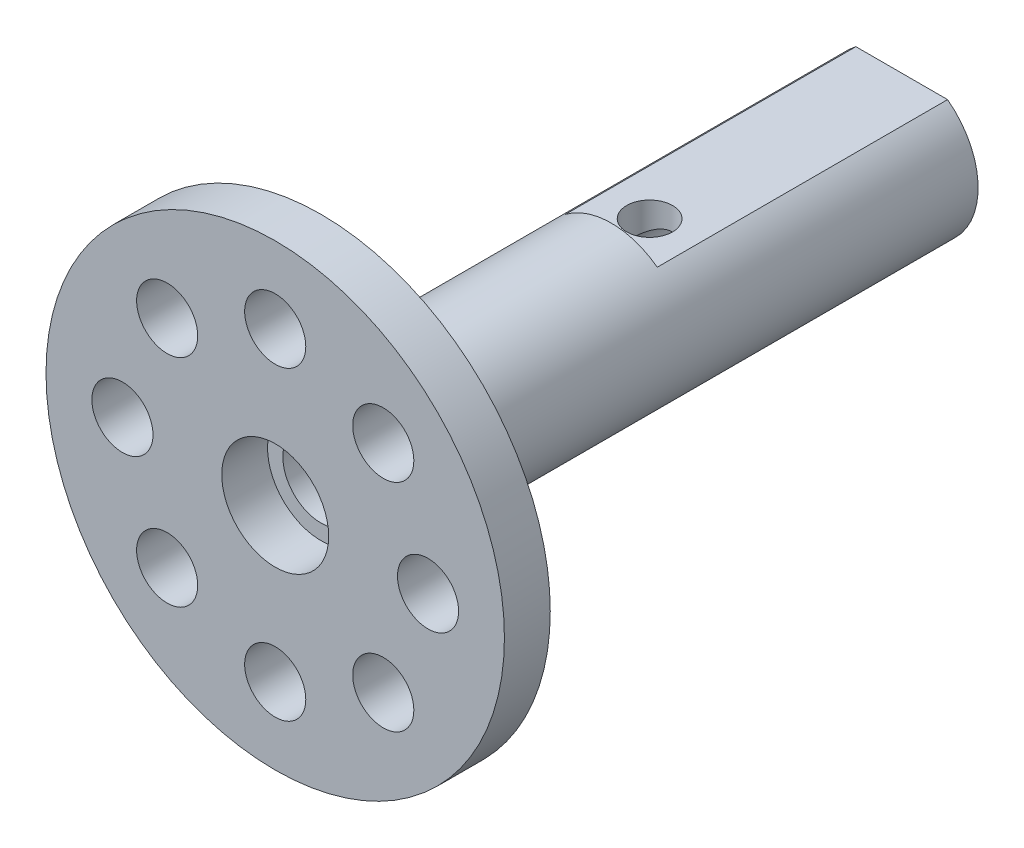
ISO-10303-21;
HEADER;
FILE_DESCRIPTION(('STEP AP214'),'2;1');
FILE_NAME('part.step','',(''),(''),'','','');
FILE_SCHEMA(('AUTOMOTIVE_DESIGN { 1 0 10303 214 1 1 1 1 }'));
ENDSEC;
DATA;
#1=APPLICATION_CONTEXT('core data for automotive mechanical design processes');
#2=APPLICATION_PROTOCOL_DEFINITION('international standard','automotive_design',2000,#1);
#3=PRODUCT_CONTEXT('',#1,'mechanical');
#4=PRODUCT('Part','Part','',(#3));
#5=PRODUCT_RELATED_PRODUCT_CATEGORY('part','',(#4));
#6=PRODUCT_DEFINITION_FORMATION('','',#4);
#7=PRODUCT_DEFINITION_CONTEXT('part definition',#1,'design');
#8=PRODUCT_DEFINITION('design','',#6,#7);
#9=PRODUCT_DEFINITION_SHAPE('','',#8);
#10=(LENGTH_UNIT() NAMED_UNIT(*) SI_UNIT(.MILLI.,.METRE.));
#11=(NAMED_UNIT(*) PLANE_ANGLE_UNIT() SI_UNIT($,.RADIAN.));
#12=(NAMED_UNIT(*) SI_UNIT($,.STERADIAN.) SOLID_ANGLE_UNIT());
#13=UNCERTAINTY_MEASURE_WITH_UNIT(LENGTH_MEASURE(1.E-05),#10,'distance_accuracy_value','');
#14=(GEOMETRIC_REPRESENTATION_CONTEXT(3) GLOBAL_UNCERTAINTY_ASSIGNED_CONTEXT((#13)) GLOBAL_UNIT_ASSIGNED_CONTEXT((#10,
#11,#12)) REPRESENTATION_CONTEXT('',''));
#15=CARTESIAN_POINT('',(0.,0.,0.));
#16=DIRECTION('',(0.,0.,1.));
#17=DIRECTION('',(1.,0.,0.));
#18=AXIS2_PLACEMENT_3D('',#15,#16,#17);
#19=CARTESIAN_POINT('',(0.,0.,41.));
#20=DIRECTION('',(0.,0.,-1.));
#21=DIRECTION('',(-1.,0.,0.));
#22=AXIS2_PLACEMENT_3D('',#19,#20,#21);
#23=CYLINDRICAL_SURFACE('',#22,2.5);
#24=CARTESIAN_POINT('',(0.,-2.5,18.));
#25=CARTESIAN_POINT('',(0.0767298334620158,-2.49999625789732,17.9999959089901));
#26=CARTESIAN_POINT('',(0.153582320644178,-2.4964290461501,17.9940713290737));
#27=CARTESIAN_POINT('',(0.304975509530679,-2.48249903608568,17.9706756804847));
#28=CARTESIAN_POINT('',(0.379510034596047,-2.47211948032719,17.9531761381458));
#29=CARTESIAN_POINT('',(0.523751827790836,-2.44561558054488,17.9076136388331));
#30=CARTESIAN_POINT('',(0.593481028226565,-2.42951973272944,17.8796030418368));
#31=CARTESIAN_POINT('',(0.727030318214658,-2.39295367626407,17.814139666859));
#32=CARTESIAN_POINT('',(0.790851869416382,-2.37248455380255,17.7766892330313));
#33=CARTESIAN_POINT('',(0.916299278999314,-2.32705360719088,17.6902251732914));
#34=CARTESIAN_POINT('',(0.977384020081414,-2.30186792195985,17.6405463046486));
#35=CARTESIAN_POINT('',(1.09088270411891,-2.25030439279634,17.5325327961717));
#36=CARTESIAN_POINT('',(1.14328534948112,-2.22392505153571,17.4741870628127));
#37=CARTESIAN_POINT('',(1.24444996762974,-2.1691106699591,17.3420764895033));
#38=CARTESIAN_POINT('',(1.29197766378809,-2.14082017703649,17.2672982290187));
#39=CARTESIAN_POINT('',(1.37361437764896,-2.08938301412124,17.1091534267569));
#40=CARTESIAN_POINT('',(1.4077451733516,-2.06622802273938,17.0258011037524));
#41=CARTESIAN_POINT('',(1.45440601714221,-2.0335462966093,16.8734035493468));
#42=CARTESIAN_POINT('',(1.47016197246826,-2.02207883137591,16.8057640013897));
#43=CARTESIAN_POINT('',(1.49216172340475,-2.00590308295503,16.6681962841696));
#44=CARTESIAN_POINT('',(1.49841734556836,-2.00118639643759,16.5982710712455));
#45=CARTESIAN_POINT('',(1.50105508796009,-1.99920922463856,16.4579885057827));
#46=CARTESIAN_POINT('',(1.49741783408419,-2.00196337012718,16.3876305749068));
#47=CARTESIAN_POINT('',(1.48046060478828,-2.01453261443741,16.2487212245724));
#48=CARTESIAN_POINT('',(1.46713334620103,-2.02435302432226,16.1801712041526));
#49=CARTESIAN_POINT('',(1.43173921881792,-2.04953186944258,16.0474697578719));
#50=CARTESIAN_POINT('',(1.40978748666087,-2.06481711652537,15.9832729460755));
#51=CARTESIAN_POINT('',(1.35795061770837,-2.09927051350828,15.8593050090719));
#52=CARTESIAN_POINT('',(1.32806257259705,-2.11844008623465,15.7995355165761));
#53=CARTESIAN_POINT('',(1.25517983184583,-2.16255327268985,15.6750159028772));
#54=CARTESIAN_POINT('',(1.21080724397723,-2.18792043372992,15.6112219070451));
#55=CARTESIAN_POINT('',(1.11291092784003,-2.23930599764381,15.491323516333));
#56=CARTESIAN_POINT('',(1.05937845100579,-2.26532500262149,15.4352265660235));
#57=CARTESIAN_POINT('',(0.935811834382971,-2.31935504958316,15.3243870181782));
#58=CARTESIAN_POINT('',(0.864517682704961,-2.34713836268532,15.270922693984));
#59=CARTESIAN_POINT('',(0.712276050459004,-2.3977242843398,15.1768779528021));
#60=CARTESIAN_POINT('',(0.631333763943569,-2.42052955425515,15.13629064621));
#61=CARTESIAN_POINT('',(0.467197585268211,-2.45730392066151,15.0720678172041));
#62=CARTESIAN_POINT('',(0.384467624173585,-2.47173957439704,15.0475246442841));
#63=CARTESIAN_POINT('',(0.215047895144645,-2.4921884281355,15.0129888025946));
#64=CARTESIAN_POINT('',(0.128363005661325,-2.49821172952738,15.0029786822464));
#65=CARTESIAN_POINT('',(-0.0337146143773909,-2.5009057037461,14.9984921523217));
#66=CARTESIAN_POINT('',(-0.109042473418712,-2.49873521714286,15.0020911449148));
#67=CARTESIAN_POINT('',(-0.257829401986055,-2.48778712087049,15.0204258530719));
#68=CARTESIAN_POINT('',(-0.331288509376101,-2.47900964518037,15.0351613428058));
#69=CARTESIAN_POINT('',(-0.472574932157608,-2.45594792442191,15.0745434328125));
#70=CARTESIAN_POINT('',(-0.540495750928479,-2.44180275662555,15.0989403490735));
#71=CARTESIAN_POINT('',(-0.671265749087259,-2.40913880862845,15.1566773763653));
#72=CARTESIAN_POINT('',(-0.734113924963904,-2.39061916586511,15.1900192513467));
#73=CARTESIAN_POINT('',(-0.86000626282386,-2.34845496237361,15.2685569792087));
#74=CARTESIAN_POINT('',(-0.922394150456834,-2.3244780273988,15.3146238290784));
#75=CARTESIAN_POINT('',(-1.03902603131013,-2.27474265574732,15.4153913934886));
#76=CARTESIAN_POINT('',(-1.09326040273738,-2.24898216586361,15.4701021548525));
#77=CARTESIAN_POINT('',(-1.19931996735579,-2.19445423909891,15.5949103900371));
#78=CARTESIAN_POINT('',(-1.24991019630914,-2.16573241746291,15.6660838854655));
#79=CARTESIAN_POINT('',(-1.33845238915667,-2.1121618206671,15.8172160245682));
#80=CARTESIAN_POINT('',(-1.37641766769781,-2.0873089799769,15.8971652938928));
#81=CARTESIAN_POINT('',(-1.43142578795776,-2.04984909240519,16.0462430223067));
#82=CARTESIAN_POINT('',(-1.4512162533619,-2.03575659328729,16.1139803123586));
#83=CARTESIAN_POINT('',(-1.48113663905972,-2.01409605743544,16.2525320780801));
#84=CARTESIAN_POINT('',(-1.49127995297631,-2.00651897642721,16.3233421443278));
#85=CARTESIAN_POINT('',(-1.50134130416631,-1.99900446616268,16.466376947597));
#86=CARTESIAN_POINT('',(-1.50122089107869,-1.99909576445937,16.538605990687));
#87=CARTESIAN_POINT('',(-1.49066472959328,-2.0069771789285,16.6818944356095));
#88=CARTESIAN_POINT('',(-1.48022337215759,-2.0147714813882,16.7529531800806));
#89=CARTESIAN_POINT('',(-1.45040174148913,-2.0363318524298,16.8884884175722));
#90=CARTESIAN_POINT('',(-1.43147636845351,-2.0497921180558,16.9531170943069));
#91=CARTESIAN_POINT('',(-1.38563242076993,-2.08105501960151,17.0783372544742));
#92=CARTESIAN_POINT('',(-1.3587108358848,-2.09885929040482,17.1389272069606));
#93=CARTESIAN_POINT('',(-1.29289245555732,-2.14012990550917,17.2643198572208));
#94=CARTESIAN_POINT('',(-1.25279167675753,-2.16404587582639,17.3283411038543));
#95=CARTESIAN_POINT('',(-1.16375698389084,-2.21320127030768,17.4493800726173));
#96=CARTESIAN_POINT('',(-1.11481579607798,-2.23844177205021,17.5063919621526));
#97=CARTESIAN_POINT('',(-1.00009777425734,-2.29225690291476,17.6213509491317));
#98=CARTESIAN_POINT('',(-0.932876819313905,-2.32070308663658,17.6779310748962));
#99=CARTESIAN_POINT('',(-0.78846243444559,-2.37365428872367,17.7790978558633));
#100=CARTESIAN_POINT('',(-0.71126544450154,-2.39815789310936,17.8236802119848));
#101=CARTESIAN_POINT('',(-0.551125230801453,-2.43985578654394,17.8977858075737));
#102=CARTESIAN_POINT('',(-0.468430086957213,-2.45725077479787,17.9277280649268));
#103=CARTESIAN_POINT('',(-0.297973306118807,-2.48366273001246,17.972724695211));
#104=CARTESIAN_POINT('',(-0.210232099648612,-2.49271125871485,17.987835167857));
#105=CARTESIAN_POINT('',(-0.101558096917536,-2.49802001168187,17.9966974547087));
#106=CARTESIAN_POINT('',(-0.0812762590282773,-2.49876114656362,17.9979344173061));
#107=CARTESIAN_POINT('',(-0.0406658206871123,-2.49975164517367,17.9995862463709));
#108=CARTESIAN_POINT('',(-0.0203372186375694,-2.50000099184316,18.0000010843209));
#109=CARTESIAN_POINT('',(0.,-2.5,18.));
#110=B_SPLINE_CURVE_WITH_KNOTS('',3,(#24,#25,#26,#27,#28,#29,#30,#31,#32,#33,#34,#35,#36,#37,
#38,#39,#40,#41,#42,#43,#44,#45,#46,#47,#48,#49,#50,#51,#52,#53,#54,#55,#56,#57,#58,#59,#60,#61,
#62,#63,#64,#65,#66,#67,#68,#69,#70,#71,#72,#73,#74,#75,#76,#77,#78,#79,#80,#81,#82,#83,#84,#85,
#86,#87,#88,#89,#90,#91,#92,#93,#94,#95,#96,#97,#98,#99,#100,#101,#102,#103,#104,#105,#106,#107,
#108,#109),.UNSPECIFIED.,.T.,.F.,(4,2,2,2,2,2,2,2,2,2,2,2,2,2,2,2,2,2,2,2,2,2,2,2,2,2,2,2,2,2,2,
2,2,2,2,2,2,2,2,2,2,2,4),(0.,0.230102237548649,0.460772627520011,0.69030888460001,
0.919788197992274,1.16681590732472,1.414162579348,1.69183813189807,1.96906040692091,
2.17933829855633,2.38935420916578,2.59978170870726,2.81036753273872,3.01823267593207,
3.22617409809868,3.47046995225162,3.71500044803674,3.99360957884691,4.27206939275324,
4.53296790696559,4.79355286918235,5.01875602722426,5.24395461863455,5.46367785689771,
5.68344445659025,5.92601365818362,6.16886690081836,6.44336762428009,6.71757792616456,
6.93257787314692,7.14727888733319,7.36278425777433,7.57840681155725,7.78364098331142,
7.98895251523035,8.22578610052286,8.46281544370208,8.73854311775519,9.01436946031985,
9.28175654462677,9.54812832184448,9.60911473335177,9.67010326027641),.UNSPECIFIED.);
#111=CARTESIAN_POINT('',(0.,-2.5,18.));
#112=VERTEX_POINT('',#111);
#113=EDGE_CURVE('E184',#112,#112,#110,.T.);
#114=ORIENTED_EDGE('',*,*,#113,.F.);
#115=EDGE_LOOP('',(#114));
#116=FACE_BOUND('',#115,.T.);
#117=CARTESIAN_POINT('',(0.,0.,0.));
#118=DIRECTION('',(0.,0.,-1.));
#119=DIRECTION('',(-1.,0.,0.));
#120=AXIS2_PLACEMENT_3D('',#117,#118,#119);
#121=CIRCLE('',#120,2.5);
#122=CARTESIAN_POINT('',(-2.5,0.,0.));
#123=VERTEX_POINT('',#122);
#124=EDGE_CURVE('E185',#123,#123,#121,.T.);
#125=ORIENTED_EDGE('',*,*,#124,.T.);
#126=EDGE_LOOP('',(#125));
#127=FACE_BOUND('',#126,.T.);
#128=CARTESIAN_POINT('',(0.,2.5,18.));
#129=CARTESIAN_POINT('',(-0.0767298334620155,2.49999625789733,17.9999959089901));
#130=CARTESIAN_POINT('',(-0.153582320644177,2.4964290461501,17.9940713290737));
#131=CARTESIAN_POINT('',(-0.304975509530678,2.48249903608567,17.9706756804847));
#132=CARTESIAN_POINT('',(-0.379510034596046,2.47211948032719,17.9531761381458));
#133=CARTESIAN_POINT('',(-0.523751827790837,2.44561558054488,17.9076136388331));
#134=CARTESIAN_POINT('',(-0.593481028226567,2.42951973272944,17.8796030418368));
#135=CARTESIAN_POINT('',(-0.727030318214659,2.39295367626407,17.814139666859));
#136=CARTESIAN_POINT('',(-0.790851869416383,2.37248455380255,17.7766892330313));
#137=CARTESIAN_POINT('',(-0.916299278999314,2.32705360719088,17.6902251732914));
#138=CARTESIAN_POINT('',(-0.977384020081414,2.30186792195985,17.6405463046486));
#139=CARTESIAN_POINT('',(-1.09088270411891,2.25030439279634,17.5325327961717));
#140=CARTESIAN_POINT('',(-1.14328534948112,2.22392505153571,17.4741870628127));
#141=CARTESIAN_POINT('',(-1.24444996762974,2.1691106699591,17.3420764895033));
#142=CARTESIAN_POINT('',(-1.29197766378809,2.14082017703649,17.2672982290187));
#143=CARTESIAN_POINT('',(-1.37361437764896,2.08938301412124,17.1091534267569));
#144=CARTESIAN_POINT('',(-1.4077451733516,2.06622802273938,17.0258011037524));
#145=CARTESIAN_POINT('',(-1.45440601714221,2.0335462966093,16.8734035493468));
#146=CARTESIAN_POINT('',(-1.47016197246826,2.02207883137591,16.8057640013897));
#147=CARTESIAN_POINT('',(-1.49216172340475,2.00590308295503,16.6681962841696));
#148=CARTESIAN_POINT('',(-1.49841734556836,2.00118639643759,16.5982710712455));
#149=CARTESIAN_POINT('',(-1.50105508796009,1.99920922463856,16.4579885057827));
#150=CARTESIAN_POINT('',(-1.49741783408419,2.00196337012718,16.3876305749068));
#151=CARTESIAN_POINT('',(-1.48046060478828,2.01453261443741,16.2487212245724));
#152=CARTESIAN_POINT('',(-1.46713334620103,2.02435302432226,16.1801712041526));
#153=CARTESIAN_POINT('',(-1.43173921881793,2.04953186944258,16.0474697578719));
#154=CARTESIAN_POINT('',(-1.40978748666087,2.06481711652537,15.9832729460755));
#155=CARTESIAN_POINT('',(-1.35795061770837,2.09927051350828,15.8593050090719));
#156=CARTESIAN_POINT('',(-1.32806257259705,2.11844008623465,15.7995355165761));
#157=CARTESIAN_POINT('',(-1.25517983184583,2.16255327268985,15.6750159028772));
#158=CARTESIAN_POINT('',(-1.21080724397723,2.18792043372992,15.6112219070451));
#159=CARTESIAN_POINT('',(-1.11291092784003,2.23930599764381,15.491323516333));
#160=CARTESIAN_POINT('',(-1.05937845100579,2.26532500262149,15.4352265660235));
#161=CARTESIAN_POINT('',(-0.935811834382971,2.31935504958316,15.3243870181782));
#162=CARTESIAN_POINT('',(-0.864517682704962,2.34713836268532,15.270922693984));
#163=CARTESIAN_POINT('',(-0.712276050459006,2.3977242843398,15.1768779528021));
#164=CARTESIAN_POINT('',(-0.63133376394357,2.42052955425515,15.1362906462101));
#165=CARTESIAN_POINT('',(-0.467197585268212,2.45730392066151,15.0720678172041));
#166=CARTESIAN_POINT('',(-0.384467624173586,2.47173957439703,15.0475246442841));
#167=CARTESIAN_POINT('',(-0.215047895144646,2.4921884281355,15.0129888025946));
#168=CARTESIAN_POINT('',(-0.128363005661326,2.49821172952738,15.0029786822464));
#169=CARTESIAN_POINT('',(0.0337146143773895,2.5009057037461,14.9984921523217));
#170=CARTESIAN_POINT('',(0.109042473418711,2.49873521714286,15.0020911449148));
#171=CARTESIAN_POINT('',(0.257829401986054,2.48778712087049,15.0204258530719));
#172=CARTESIAN_POINT('',(0.3312885093761,2.47900964518037,15.0351613428058));
#173=CARTESIAN_POINT('',(0.472574932157608,2.45594792442191,15.0745434328125));
#174=CARTESIAN_POINT('',(0.540495750928479,2.44180275662555,15.0989403490735));
#175=CARTESIAN_POINT('',(0.671265749087258,2.40913880862845,15.1566773763653));
#176=CARTESIAN_POINT('',(0.734113924963904,2.39061916586511,15.1900192513467));
#177=CARTESIAN_POINT('',(0.86000626282386,2.34845496237361,15.2685569792087));
#178=CARTESIAN_POINT('',(0.922394150456833,2.3244780273988,15.3146238290784));
#179=CARTESIAN_POINT('',(1.03902603131013,2.27474265574732,15.4153913934886));
#180=CARTESIAN_POINT('',(1.09326040273738,2.24898216586361,15.4701021548525));
#181=CARTESIAN_POINT('',(1.19931996735579,2.19445423909891,15.5949103900371));
#182=CARTESIAN_POINT('',(1.24991019630914,2.16573241746291,15.6660838854655));
#183=CARTESIAN_POINT('',(1.33845238915667,2.1121618206671,15.8172160245682));
#184=CARTESIAN_POINT('',(1.37641766769781,2.0873089799769,15.8971652938928));
#185=CARTESIAN_POINT('',(1.43142578795776,2.04984909240519,16.0462430223067));
#186=CARTESIAN_POINT('',(1.4512162533619,2.03575659328729,16.1139803123586));
#187=CARTESIAN_POINT('',(1.48113663905972,2.01409605743544,16.2525320780801));
#188=CARTESIAN_POINT('',(1.49127995297631,2.00651897642721,16.3233421443278));
#189=CARTESIAN_POINT('',(1.50134130416631,1.99900446616268,16.466376947597));
#190=CARTESIAN_POINT('',(1.50122089107869,1.99909576445937,16.538605990687));
#191=CARTESIAN_POINT('',(1.49066472959328,2.0069771789285,16.6818944356095));
#192=CARTESIAN_POINT('',(1.48022337215759,2.0147714813882,16.7529531800806));
#193=CARTESIAN_POINT('',(1.45040174148913,2.0363318524298,16.8884884175722));
#194=CARTESIAN_POINT('',(1.43147636845351,2.0497921180558,16.9531170943069));
#195=CARTESIAN_POINT('',(1.38563242076993,2.08105501960151,17.0783372544742));
#196=CARTESIAN_POINT('',(1.3587108358848,2.09885929040482,17.1389272069606));
#197=CARTESIAN_POINT('',(1.29289245555732,2.14012990550917,17.2643198572208));
#198=CARTESIAN_POINT('',(1.25279167675753,2.16404587582639,17.3283411038543));
#199=CARTESIAN_POINT('',(1.16375698389084,2.21320127030768,17.4493800726173));
#200=CARTESIAN_POINT('',(1.11481579607798,2.23844177205021,17.5063919621526));
#201=CARTESIAN_POINT('',(1.00009777425734,2.29225690291476,17.6213509491317));
#202=CARTESIAN_POINT('',(0.932876819313905,2.32070308663658,17.6779310748962));
#203=CARTESIAN_POINT('',(0.78846243444559,2.37365428872367,17.7790978558633));
#204=CARTESIAN_POINT('',(0.711265444501541,2.39815789310936,17.8236802119848));
#205=CARTESIAN_POINT('',(0.551125230801454,2.43985578654394,17.8977858075737));
#206=CARTESIAN_POINT('',(0.468430086957214,2.45725077479787,17.9277280649268));
#207=CARTESIAN_POINT('',(0.297973306118809,2.48366273001246,17.972724695211));
#208=CARTESIAN_POINT('',(0.210232099648613,2.49271125871485,17.987835167857));
#209=CARTESIAN_POINT('',(0.101558096917537,2.49802001168187,17.9966974547087));
#210=CARTESIAN_POINT('',(0.0812762590282777,2.49876114656362,17.9979344173061));
#211=CARTESIAN_POINT('',(0.0406658206871124,2.49975164517367,17.9995862463709));
#212=CARTESIAN_POINT('',(0.0203372186375695,2.50000099184316,18.0000010843209));
#213=CARTESIAN_POINT('',(0.,2.5,18.));
#214=B_SPLINE_CURVE_WITH_KNOTS('',3,(#128,#129,#130,#131,#132,#133,#134,#135,#136,#137,#138,
#139,#140,#141,#142,#143,#144,#145,#146,#147,#148,#149,#150,#151,#152,#153,#154,#155,#156,#157,
#158,#159,#160,#161,#162,#163,#164,#165,#166,#167,#168,#169,#170,#171,#172,#173,#174,#175,#176,
#177,#178,#179,#180,#181,#182,#183,#184,#185,#186,#187,#188,#189,#190,#191,#192,#193,#194,#195,
#196,#197,#198,#199,#200,#201,#202,#203,#204,#205,#206,#207,#208,#209,#210,#211,#212,#213),
.UNSPECIFIED.,.T.,.F.,(4,2,2,2,2,2,2,2,2,2,2,2,2,2,2,2,2,2,2,2,2,2,2,2,2,2,2,2,2,2,2,2,2,2,2,2,
2,2,2,2,2,2,4),(0.,0.230102237548649,0.460772627520011,0.690308884600014,0.919788197992274,
1.16681590732472,1.414162579348,1.69183813189807,1.96906040692091,2.17933829855633,
2.38935420916578,2.59978170870726,2.81036753273872,3.01823267593206,3.22617409809868,
3.47046995225162,3.71500044803674,3.99360957884691,4.27206939275323,4.53296790696559,
4.79355286918235,5.01875602722425,5.24395461863455,5.46367785689771,5.68344445659025,
5.92601365818361,6.16886690081836,6.44336762428008,6.71757792616455,6.93257787314692,
7.14727888733318,7.36278425777432,7.57840681155725,7.78364098331142,7.98895251523035,
8.22578610052286,8.46281544370208,8.73854311775519,9.01436946031985,9.28175654462677,
9.54812832184448,9.60911473335177,9.67010326027641),.UNSPECIFIED.);
#215=CARTESIAN_POINT('',(0.,2.5,18.));
#216=VERTEX_POINT('',#215);
#217=EDGE_CURVE('E178',#216,#216,#214,.T.);
#218=ORIENTED_EDGE('',*,*,#217,.F.);
#219=EDGE_LOOP('',(#218));
#220=FACE_BOUND('',#219,.T.);
#221=CARTESIAN_POINT('',(0.,0.,38.));
#222=DIRECTION('',(0.,0.,1.));
#223=DIRECTION('',(1.,0.,0.));
#224=AXIS2_PLACEMENT_3D('',#221,#222,#223);
#225=CIRCLE('',#224,2.5);
#226=CARTESIAN_POINT('',(2.5,0.,38.));
#227=VERTEX_POINT('',#226);
#228=EDGE_CURVE('E43',#227,#227,#225,.F.);
#229=ORIENTED_EDGE('',*,*,#228,.F.);
#230=EDGE_LOOP('',(#229));
#231=FACE_BOUND('',#230,.T.);
#232=ADVANCED_FACE('F39',(#116,#127,#220,#231),#23,.F.);
#233=CARTESIAN_POINT('',(0.,-15.,16.5));
#234=DIRECTION('',(0.,1.,0.));
#235=DIRECTION('',(0.,0.,1.));
#236=AXIS2_PLACEMENT_3D('',#233,#234,#235);
#237=CYLINDRICAL_SURFACE('',#236,1.5);
#238=ORIENTED_EDGE('',*,*,#113,.T.);
#239=EDGE_LOOP('',(#238));
#240=FACE_BOUND('',#239,.T.);
#241=CARTESIAN_POINT('',(0.,-4.,16.5));
#242=DIRECTION('',(0.,1.,0.));
#243=DIRECTION('',(-1.,0.,0.));
#244=AXIS2_PLACEMENT_3D('',#241,#242,#243);
#245=CIRCLE('',#244,1.5);
#246=CARTESIAN_POINT('',(-1.5,-4.,16.5));
#247=VERTEX_POINT('',#246);
#248=EDGE_CURVE('E109',#247,#247,#245,.T.);
#249=ORIENTED_EDGE('',*,*,#248,.F.);
#250=EDGE_LOOP('',(#249));
#251=FACE_BOUND('',#250,.T.);
#252=ADVANCED_FACE('F194',(#240,#251),#237,.F.);
#253=CARTESIAN_POINT('',(0.,0.,35.));
#254=DIRECTION('',(0.,0.,-1.));
#255=DIRECTION('',(-1.,0.,0.));
#256=AXIS2_PLACEMENT_3D('',#253,#254,#255);
#257=CYLINDRICAL_SURFACE('',#256,5.);
#258=CARTESIAN_POINT('',(0.,0.,35.));
#259=DIRECTION('',(0.,0.,1.));
#260=DIRECTION('',(1.,0.,0.));
#261=AXIS2_PLACEMENT_3D('',#258,#259,#260);
#262=CIRCLE('',#261,5.);
#263=CARTESIAN_POINT('',(5.,0.,35.));
#264=VERTEX_POINT('',#263);
#265=EDGE_CURVE('E11',#264,#264,#262,.T.);
#266=ORIENTED_EDGE('',*,*,#265,.F.);
#267=EDGE_LOOP('',(#266));
#268=FACE_BOUND('',#267,.T.);
#269=CARTESIAN_POINT('',(0.,0.,19.));
#270=DIRECTION('',(0.,0.,-1.));
#271=DIRECTION('',(-1.,0.,0.));
#272=AXIS2_PLACEMENT_3D('',#269,#270,#271);
#273=CIRCLE('',#272,5.);
#274=CARTESIAN_POINT('',(3.,-4.,19.));
#275=VERTEX_POINT('',#274);
#276=CARTESIAN_POINT('',(-3.,-4.,19.));
#277=VERTEX_POINT('',#276);
#278=EDGE_CURVE('E84',#275,#277,#273,.T.);
#279=ORIENTED_EDGE('',*,*,#278,.F.);
#280=DIRECTION('',(0.,0.,-1.));
#281=VECTOR('',#280,1.);
#282=CARTESIAN_POINT('',(3.,-4.,19.));
#283=LINE('',#282,#281);
#284=CARTESIAN_POINT('',(3.,-4.,0.));
#285=VERTEX_POINT('',#284);
#286=EDGE_CURVE('E92',#275,#285,#283,.T.);
#287=ORIENTED_EDGE('',*,*,#286,.T.);
#288=CARTESIAN_POINT('',(0.,0.,0.));
#289=DIRECTION('',(0.,0.,1.));
#290=DIRECTION('',(1.,0.,0.));
#291=AXIS2_PLACEMENT_3D('',#288,#289,#290);
#292=CIRCLE('',#291,5.);
#293=CARTESIAN_POINT('',(3.,4.,0.));
#294=VERTEX_POINT('',#293);
#295=EDGE_CURVE('E170',#285,#294,#292,.T.);
#296=ORIENTED_EDGE('',*,*,#295,.T.);
#297=DIRECTION('',(0.,0.,-1.));
#298=VECTOR('',#297,1.);
#299=CARTESIAN_POINT('',(3.,4.,19.));
#300=LINE('',#299,#298);
#301=CARTESIAN_POINT('',(3.,4.,19.));
#302=VERTEX_POINT('',#301);
#303=EDGE_CURVE('E64',#302,#294,#300,.T.);
#304=ORIENTED_EDGE('',*,*,#303,.F.);
#305=CARTESIAN_POINT('',(0.,0.,19.));
#306=DIRECTION('',(0.,0.,-1.));
#307=DIRECTION('',(-1.,0.,0.));
#308=AXIS2_PLACEMENT_3D('',#305,#306,#307);
#309=CIRCLE('',#308,5.);
#310=CARTESIAN_POINT('',(-3.,4.,19.));
#311=VERTEX_POINT('',#310);
#312=EDGE_CURVE('E102',#311,#302,#309,.T.);
#313=ORIENTED_EDGE('',*,*,#312,.F.);
#314=DIRECTION('',(0.,0.,-1.));
#315=VECTOR('',#314,1.);
#316=CARTESIAN_POINT('',(-3.,4.,19.));
#317=LINE('',#316,#315);
#318=CARTESIAN_POINT('',(-3.,4.,0.));
#319=VERTEX_POINT('',#318);
#320=EDGE_CURVE('E110',#311,#319,#317,.T.);
#321=ORIENTED_EDGE('',*,*,#320,.T.);
#322=CARTESIAN_POINT('',(-3.,-4.,0.));
#323=VERTEX_POINT('',#322);
#324=EDGE_CURVE('E48',#319,#323,#292,.T.);
#325=ORIENTED_EDGE('',*,*,#324,.T.);
#326=DIRECTION('',(0.,0.,-1.));
#327=VECTOR('',#326,1.);
#328=CARTESIAN_POINT('',(-3.,-4.,19.));
#329=LINE('',#328,#327);
#330=EDGE_CURVE('E56',#277,#323,#329,.T.);
#331=ORIENTED_EDGE('',*,*,#330,.F.);
#332=EDGE_LOOP('',(#279,#287,#296,#304,#313,#321,#325,#331));
#333=FACE_BOUND('',#332,.T.);
#334=ADVANCED_FACE('F41',(#268,#333),#257,.T.);
#335=CARTESIAN_POINT('',(0.,0.,0.));
#336=DIRECTION('',(0.,0.,1.));
#337=DIRECTION('',(1.,0.,0.));
#338=AXIS2_PLACEMENT_3D('',#335,#336,#337);
#339=PLANE('',#338);
#340=ORIENTED_EDGE('',*,*,#124,.F.);
#341=EDGE_LOOP('',(#340));
#342=FACE_BOUND('',#341,.T.);
#343=ORIENTED_EDGE('',*,*,#295,.F.);
#344=DIRECTION('',(1.,0.,0.));
#345=VECTOR('',#344,1.);
#346=CARTESIAN_POINT('',(3.,-4.,0.));
#347=LINE('',#346,#345);
#348=EDGE_CURVE('E89',#323,#285,#347,.T.);
#349=ORIENTED_EDGE('',*,*,#348,.F.);
#350=ORIENTED_EDGE('',*,*,#324,.F.);
#351=DIRECTION('',(-1.,0.,0.));
#352=VECTOR('',#351,1.);
#353=CARTESIAN_POINT('',(3.,4.,0.));
#354=LINE('',#353,#352);
#355=EDGE_CURVE('E105',#294,#319,#354,.T.);
#356=ORIENTED_EDGE('',*,*,#355,.F.);
#357=EDGE_LOOP('',(#343,#349,#350,#356));
#358=FACE_BOUND('',#357,.T.);
#359=ADVANCED_FACE('F225',(#342,#358),#339,.F.);
#360=CARTESIAN_POINT('',(0.,0.,38.));
#361=DIRECTION('',(0.,0.,-1.));
#362=DIRECTION('',(-1.,0.,0.));
#363=AXIS2_PLACEMENT_3D('',#360,#361,#362);
#364=CYLINDRICAL_SURFACE('',#363,6.);
#365=CARTESIAN_POINT('',(0.,0.,38.));
#366=DIRECTION('',(0.,0.,1.));
#367=DIRECTION('',(1.,0.,0.));
#368=AXIS2_PLACEMENT_3D('',#365,#366,#367);
#369=CIRCLE('',#368,6.);
#370=CARTESIAN_POINT('',(6.,0.,38.));
#371=VERTEX_POINT('',#370);
#372=EDGE_CURVE('E167',#371,#371,#369,.T.);
#373=ORIENTED_EDGE('',*,*,#372,.F.);
#374=EDGE_LOOP('',(#373));
#375=FACE_BOUND('',#374,.T.);
#376=CARTESIAN_POINT('',(0.,0.,35.));
#377=DIRECTION('',(0.,0.,1.));
#378=DIRECTION('',(1.,0.,0.));
#379=AXIS2_PLACEMENT_3D('',#376,#377,#378);
#380=CIRCLE('',#379,6.);
#381=CARTESIAN_POINT('',(6.,0.,35.));
#382=VERTEX_POINT('',#381);
#383=EDGE_CURVE('E164',#382,#382,#380,.T.);
#384=ORIENTED_EDGE('',*,*,#383,.T.);
#385=EDGE_LOOP('',(#384));
#386=FACE_BOUND('',#385,.T.);
#387=ADVANCED_FACE('F288',(#375,#386),#364,.T.);
#388=CARTESIAN_POINT('',(0.,0.,35.));
#389=DIRECTION('',(0.,0.,1.));
#390=DIRECTION('',(1.,0.,0.));
#391=AXIS2_PLACEMENT_3D('',#388,#389,#390);
#392=PLANE('',#391);
#393=ORIENTED_EDGE('',*,*,#265,.T.);
#394=EDGE_LOOP('',(#393));
#395=FACE_BOUND('',#394,.T.);
#396=ORIENTED_EDGE('',*,*,#383,.F.);
#397=EDGE_LOOP('',(#396));
#398=FACE_BOUND('',#397,.T.);
#399=ADVANCED_FACE('F278',(#395,#398),#392,.F.);
#400=CARTESIAN_POINT('',(0.,0.,41.));
#401=DIRECTION('',(0.,0.,1.));
#402=DIRECTION('',(1.,0.,0.));
#403=AXIS2_PLACEMENT_3D('',#400,#401,#402);
#404=PLANE('',#403);
#405=CARTESIAN_POINT('',(0.,0.,41.));
#406=DIRECTION('',(0.,0.,1.));
#407=DIRECTION('',(1.,0.,0.));
#408=AXIS2_PLACEMENT_3D('',#405,#406,#407);
#409=CIRCLE('',#408,3.5);
#410=CARTESIAN_POINT('',(3.5,0.,41.));
#411=VERTEX_POINT('',#410);
#412=EDGE_CURVE('E217',#411,#411,#409,.T.);
#413=ORIENTED_EDGE('',*,*,#412,.F.);
#414=EDGE_LOOP('',(#413));
#415=FACE_BOUND('',#414,.T.);
#416=CARTESIAN_POINT('',(-7.07106781186512,-7.07106781186583,41.));
#417=DIRECTION('',(0.,0.,1.));
#418=DIRECTION('',(1.,0.,0.));
#419=AXIS2_PLACEMENT_3D('',#416,#417,#418);
#420=CIRCLE('',#419,2.00000000000029);
#421=CARTESIAN_POINT('',(-5.07106781186483,-7.07106781186583,41.));
#422=VERTEX_POINT('',#421);
#423=EDGE_CURVE('E119',#422,#422,#420,.T.);
#424=ORIENTED_EDGE('',*,*,#423,.F.);
#425=EDGE_LOOP('',(#424));
#426=FACE_BOUND('',#425,.T.);
#427=CARTESIAN_POINT('',(7.07106781186551,7.07106781186544,41.));
#428=DIRECTION('',(0.,0.,1.));
#429=DIRECTION('',(1.,0.,0.));
#430=AXIS2_PLACEMENT_3D('',#427,#428,#429);
#431=CIRCLE('',#430,2.);
#432=CARTESIAN_POINT('',(9.07106781186551,7.07106781186544,41.));
#433=VERTEX_POINT('',#432);
#434=EDGE_CURVE('E131',#433,#433,#431,.T.);
#435=ORIENTED_EDGE('',*,*,#434,.F.);
#436=EDGE_LOOP('',(#435));
#437=FACE_BOUND('',#436,.T.);
#438=CARTESIAN_POINT('',(0.,-10.,41.));
#439=DIRECTION('',(0.,0.,1.));
#440=DIRECTION('',(1.,0.,0.));
#441=AXIS2_PLACEMENT_3D('',#438,#439,#440);
#442=CIRCLE('',#441,2.);
#443=CARTESIAN_POINT('',(2.,-10.,41.));
#444=VERTEX_POINT('',#443);
#445=EDGE_CURVE('E143',#444,#444,#442,.T.);
#446=ORIENTED_EDGE('',*,*,#445,.F.);
#447=EDGE_LOOP('',(#446));
#448=FACE_BOUND('',#447,.T.);
#449=CARTESIAN_POINT('',(0.,10.,41.));
#450=DIRECTION('',(0.,0.,1.));
#451=DIRECTION('',(1.,0.,0.));
#452=AXIS2_PLACEMENT_3D('',#449,#450,#451);
#453=CIRCLE('',#452,2.);
#454=CARTESIAN_POINT('',(2.,10.,41.));
#455=VERTEX_POINT('',#454);
#456=EDGE_CURVE('E155',#455,#455,#453,.T.);
#457=ORIENTED_EDGE('',*,*,#456,.F.);
#458=EDGE_LOOP('',(#457));
#459=FACE_BOUND('',#458,.T.);
#460=CARTESIAN_POINT('',(0.,0.,41.));
#461=DIRECTION('',(0.,0.,1.));
#462=DIRECTION('',(1.,0.,0.));
#463=AXIS2_PLACEMENT_3D('',#460,#461,#462);
#464=CIRCLE('',#463,15.);
#465=CARTESIAN_POINT('',(15.,0.,41.));
#466=VERTEX_POINT('',#465);
#467=EDGE_CURVE('E161',#466,#466,#464,.T.);
#468=ORIENTED_EDGE('',*,*,#467,.T.);
#469=EDGE_LOOP('',(#468));
#470=FACE_BOUND('',#469,.T.);
#471=CARTESIAN_POINT('',(10.,0.,41.));
#472=DIRECTION('',(0.,0.,1.));
#473=DIRECTION('',(1.,0.,0.));
#474=AXIS2_PLACEMENT_3D('',#471,#472,#473);
#475=CIRCLE('',#474,2.);
#476=CARTESIAN_POINT('',(12.,0.,41.));
#477=VERTEX_POINT('',#476);
#478=EDGE_CURVE('E149',#477,#477,#475,.T.);
#479=ORIENTED_EDGE('',*,*,#478,.F.);
#480=EDGE_LOOP('',(#479));
#481=FACE_BOUND('',#480,.T.);
#482=CARTESIAN_POINT('',(-10.,0.,41.));
#483=DIRECTION('',(0.,0.,1.));
#484=DIRECTION('',(1.,0.,0.));
#485=AXIS2_PLACEMENT_3D('',#482,#483,#484);
#486=CIRCLE('',#485,2.);
#487=CARTESIAN_POINT('',(-8.,0.,41.));
#488=VERTEX_POINT('',#487);
#489=EDGE_CURVE('E137',#488,#488,#486,.T.);
#490=ORIENTED_EDGE('',*,*,#489,.F.);
#491=EDGE_LOOP('',(#490));
#492=FACE_BOUND('',#491,.T.);
#493=CARTESIAN_POINT('',(7.07106781186583,-7.07106781186551,41.));
#494=DIRECTION('',(0.,0.,1.));
#495=DIRECTION('',(1.,0.,0.));
#496=AXIS2_PLACEMENT_3D('',#493,#494,#495);
#497=CIRCLE('',#496,1.9999999999999);
#498=CARTESIAN_POINT('',(9.07106781186573,-7.07106781186551,41.));
#499=VERTEX_POINT('',#498);
#500=EDGE_CURVE('E125',#499,#499,#497,.T.);
#501=ORIENTED_EDGE('',*,*,#500,.F.);
#502=EDGE_LOOP('',(#501));
#503=FACE_BOUND('',#502,.T.);
#504=CARTESIAN_POINT('',(-7.07106781186544,7.07106781186512,41.));
#505=DIRECTION('',(0.,0.,1.));
#506=DIRECTION('',(1.,0.,0.));
#507=AXIS2_PLACEMENT_3D('',#504,#505,#506);
#508=CIRCLE('',#507,2.00000000000043);
#509=CARTESIAN_POINT('',(-5.07106781186501,7.07106781186512,41.));
#510=VERTEX_POINT('',#509);
#511=EDGE_CURVE('E113',#510,#510,#508,.T.);
#512=ORIENTED_EDGE('',*,*,#511,.F.);
#513=EDGE_LOOP('',(#512));
#514=FACE_BOUND('',#513,.T.);
#515=ADVANCED_FACE('F274',(#415,#426,#437,#448,#459,#470,#481,#492,#503,#514),#404,.T.);
#516=CARTESIAN_POINT('',(0.,0.,38.));
#517=DIRECTION('',(0.,0.,1.));
#518=DIRECTION('',(1.,0.,0.));
#519=AXIS2_PLACEMENT_3D('',#516,#517,#518);
#520=PLANE('',#519);
#521=ORIENTED_EDGE('',*,*,#372,.T.);
#522=EDGE_LOOP('',(#521));
#523=FACE_BOUND('',#522,.T.);
#524=CARTESIAN_POINT('',(0.,0.,38.));
#525=DIRECTION('',(0.,0.,1.));
#526=DIRECTION('',(1.,0.,0.));
#527=AXIS2_PLACEMENT_3D('',#524,#525,#526);
#528=CIRCLE('',#527,15.);
#529=CARTESIAN_POINT('',(15.,0.,38.));
#530=VERTEX_POINT('',#529);
#531=EDGE_CURVE('E158',#530,#530,#528,.T.);
#532=ORIENTED_EDGE('',*,*,#531,.F.);
#533=EDGE_LOOP('',(#532));
#534=FACE_BOUND('',#533,.T.);
#535=CARTESIAN_POINT('',(0.,10.,38.));
#536=DIRECTION('',(0.,0.,1.));
#537=DIRECTION('',(1.,0.,0.));
#538=AXIS2_PLACEMENT_3D('',#535,#536,#537);
#539=CIRCLE('',#538,2.);
#540=CARTESIAN_POINT('',(2.,10.,38.));
#541=VERTEX_POINT('',#540);
#542=EDGE_CURVE('E152',#541,#541,#539,.T.);
#543=ORIENTED_EDGE('',*,*,#542,.T.);
#544=EDGE_LOOP('',(#543));
#545=FACE_BOUND('',#544,.T.);
#546=CARTESIAN_POINT('',(10.,0.,38.));
#547=DIRECTION('',(0.,0.,1.));
#548=DIRECTION('',(1.,0.,0.));
#549=AXIS2_PLACEMENT_3D('',#546,#547,#548);
#550=CIRCLE('',#549,2.);
#551=CARTESIAN_POINT('',(12.,0.,38.));
#552=VERTEX_POINT('',#551);
#553=EDGE_CURVE('E146',#552,#552,#550,.T.);
#554=ORIENTED_EDGE('',*,*,#553,.T.);
#555=EDGE_LOOP('',(#554));
#556=FACE_BOUND('',#555,.T.);
#557=CARTESIAN_POINT('',(0.,-10.,38.));
#558=DIRECTION('',(0.,0.,1.));
#559=DIRECTION('',(1.,0.,0.));
#560=AXIS2_PLACEMENT_3D('',#557,#558,#559);
#561=CIRCLE('',#560,2.);
#562=CARTESIAN_POINT('',(2.,-10.,38.));
#563=VERTEX_POINT('',#562);
#564=EDGE_CURVE('E140',#563,#563,#561,.T.);
#565=ORIENTED_EDGE('',*,*,#564,.T.);
#566=EDGE_LOOP('',(#565));
#567=FACE_BOUND('',#566,.T.);
#568=CARTESIAN_POINT('',(-10.,0.,38.));
#569=DIRECTION('',(0.,0.,1.));
#570=DIRECTION('',(1.,0.,0.));
#571=AXIS2_PLACEMENT_3D('',#568,#569,#570);
#572=CIRCLE('',#571,2.);
#573=CARTESIAN_POINT('',(-8.,0.,38.));
#574=VERTEX_POINT('',#573);
#575=EDGE_CURVE('E134',#574,#574,#572,.T.);
#576=ORIENTED_EDGE('',*,*,#575,.T.);
#577=EDGE_LOOP('',(#576));
#578=FACE_BOUND('',#577,.T.);
#579=CARTESIAN_POINT('',(7.07106781186551,7.07106781186544,38.));
#580=DIRECTION('',(0.,0.,1.));
#581=DIRECTION('',(1.,0.,0.));
#582=AXIS2_PLACEMENT_3D('',#579,#580,#581);
#583=CIRCLE('',#582,2.);
#584=CARTESIAN_POINT('',(9.07106781186551,7.07106781186544,38.));
#585=VERTEX_POINT('',#584);
#586=EDGE_CURVE('E128',#585,#585,#583,.T.);
#587=ORIENTED_EDGE('',*,*,#586,.T.);
#588=EDGE_LOOP('',(#587));
#589=FACE_BOUND('',#588,.T.);
#590=CARTESIAN_POINT('',(7.07106781186583,-7.07106781186551,38.));
#591=DIRECTION('',(0.,0.,1.));
#592=DIRECTION('',(1.,0.,0.));
#593=AXIS2_PLACEMENT_3D('',#590,#591,#592);
#594=CIRCLE('',#593,1.9999999999999);
#595=CARTESIAN_POINT('',(9.07106781186573,-7.07106781186551,38.));
#596=VERTEX_POINT('',#595);
#597=EDGE_CURVE('E122',#596,#596,#594,.T.);
#598=ORIENTED_EDGE('',*,*,#597,.T.);
#599=EDGE_LOOP('',(#598));
#600=FACE_BOUND('',#599,.T.);
#601=CARTESIAN_POINT('',(-7.07106781186512,-7.07106781186583,38.));
#602=DIRECTION('',(0.,0.,1.));
#603=DIRECTION('',(1.,0.,0.));
#604=AXIS2_PLACEMENT_3D('',#601,#602,#603);
#605=CIRCLE('',#604,2.00000000000029);
#606=CARTESIAN_POINT('',(-5.07106781186483,-7.07106781186583,38.));
#607=VERTEX_POINT('',#606);
#608=EDGE_CURVE('E116',#607,#607,#605,.T.);
#609=ORIENTED_EDGE('',*,*,#608,.T.);
#610=EDGE_LOOP('',(#609));
#611=FACE_BOUND('',#610,.T.);
#612=CARTESIAN_POINT('',(-7.07106781186544,7.07106781186512,38.));
#613=DIRECTION('',(0.,0.,1.));
#614=DIRECTION('',(1.,0.,0.));
#615=AXIS2_PLACEMENT_3D('',#612,#613,#614);
#616=CIRCLE('',#615,2.00000000000043);
#617=CARTESIAN_POINT('',(-5.07106781186501,7.07106781186512,38.));
#618=VERTEX_POINT('',#617);
#619=EDGE_CURVE('E98',#618,#618,#616,.T.);
#620=ORIENTED_EDGE('',*,*,#619,.T.);
#621=EDGE_LOOP('',(#620));
#622=FACE_BOUND('',#621,.T.);
#623=ADVANCED_FACE('F277',(#523,#534,#545,#556,#567,#578,#589,#600,#611,#622),#520,.F.);
#624=CARTESIAN_POINT('',(0.,0.,41.));
#625=DIRECTION('',(0.,0.,-1.));
#626=DIRECTION('',(-1.,0.,0.));
#627=AXIS2_PLACEMENT_3D('',#624,#625,#626);
#628=CYLINDRICAL_SURFACE('',#627,15.);
#629=ORIENTED_EDGE('',*,*,#467,.F.);
#630=EDGE_LOOP('',(#629));
#631=FACE_BOUND('',#630,.T.);
#632=ORIENTED_EDGE('',*,*,#531,.T.);
#633=EDGE_LOOP('',(#632));
#634=FACE_BOUND('',#633,.T.);
#635=ADVANCED_FACE('F272',(#631,#634),#628,.T.);
#636=CARTESIAN_POINT('',(0.,10.,41.));
#637=DIRECTION('',(0.,0.,-1.));
#638=DIRECTION('',(-1.,0.,0.));
#639=AXIS2_PLACEMENT_3D('',#636,#637,#638);
#640=CYLINDRICAL_SURFACE('',#639,2.);
#641=ORIENTED_EDGE('',*,*,#456,.T.);
#642=EDGE_LOOP('',(#641));
#643=FACE_BOUND('',#642,.T.);
#644=ORIENTED_EDGE('',*,*,#542,.F.);
#645=EDGE_LOOP('',(#644));
#646=FACE_BOUND('',#645,.T.);
#647=ADVANCED_FACE('F268',(#643,#646),#640,.F.);
#648=CARTESIAN_POINT('',(10.,0.,41.));
#649=DIRECTION('',(0.,0.,-1.));
#650=DIRECTION('',(-1.,0.,0.));
#651=AXIS2_PLACEMENT_3D('',#648,#649,#650);
#652=CYLINDRICAL_SURFACE('',#651,2.);
#653=ORIENTED_EDGE('',*,*,#478,.T.);
#654=EDGE_LOOP('',(#653));
#655=FACE_BOUND('',#654,.T.);
#656=ORIENTED_EDGE('',*,*,#553,.F.);
#657=EDGE_LOOP('',(#656));
#658=FACE_BOUND('',#657,.T.);
#659=ADVANCED_FACE('F264',(#655,#658),#652,.F.);
#660=CARTESIAN_POINT('',(0.,-10.,41.));
#661=DIRECTION('',(0.,0.,-1.));
#662=DIRECTION('',(-1.,0.,0.));
#663=AXIS2_PLACEMENT_3D('',#660,#661,#662);
#664=CYLINDRICAL_SURFACE('',#663,2.);
#665=ORIENTED_EDGE('',*,*,#445,.T.);
#666=EDGE_LOOP('',(#665));
#667=FACE_BOUND('',#666,.T.);
#668=ORIENTED_EDGE('',*,*,#564,.F.);
#669=EDGE_LOOP('',(#668));
#670=FACE_BOUND('',#669,.T.);
#671=ADVANCED_FACE('F260',(#667,#670),#664,.F.);
#672=CARTESIAN_POINT('',(-10.,0.,41.));
#673=DIRECTION('',(0.,0.,-1.));
#674=DIRECTION('',(-1.,0.,0.));
#675=AXIS2_PLACEMENT_3D('',#672,#673,#674);
#676=CYLINDRICAL_SURFACE('',#675,2.);
#677=ORIENTED_EDGE('',*,*,#489,.T.);
#678=EDGE_LOOP('',(#677));
#679=FACE_BOUND('',#678,.T.);
#680=ORIENTED_EDGE('',*,*,#575,.F.);
#681=EDGE_LOOP('',(#680));
#682=FACE_BOUND('',#681,.T.);
#683=ADVANCED_FACE('F256',(#679,#682),#676,.F.);
#684=CARTESIAN_POINT('',(7.07106781186551,7.07106781186544,41.));
#685=DIRECTION('',(0.,0.,-1.));
#686=DIRECTION('',(-1.,0.,0.));
#687=AXIS2_PLACEMENT_3D('',#684,#685,#686);
#688=CYLINDRICAL_SURFACE('',#687,2.);
#689=ORIENTED_EDGE('',*,*,#434,.T.);
#690=EDGE_LOOP('',(#689));
#691=FACE_BOUND('',#690,.T.);
#692=ORIENTED_EDGE('',*,*,#586,.F.);
#693=EDGE_LOOP('',(#692));
#694=FACE_BOUND('',#693,.T.);
#695=ADVANCED_FACE('F252',(#691,#694),#688,.F.);
#696=CARTESIAN_POINT('',(7.07106781186583,-7.07106781186551,41.));
#697=DIRECTION('',(0.,0.,-1.));
#698=DIRECTION('',(-1.,0.,0.));
#699=AXIS2_PLACEMENT_3D('',#696,#697,#698);
#700=CYLINDRICAL_SURFACE('',#699,1.9999999999999);
#701=ORIENTED_EDGE('',*,*,#500,.T.);
#702=EDGE_LOOP('',(#701));
#703=FACE_BOUND('',#702,.T.);
#704=ORIENTED_EDGE('',*,*,#597,.F.);
#705=EDGE_LOOP('',(#704));
#706=FACE_BOUND('',#705,.T.);
#707=ADVANCED_FACE('F248',(#703,#706),#700,.F.);
#708=CARTESIAN_POINT('',(-7.07106781186512,-7.07106781186583,41.));
#709=DIRECTION('',(0.,0.,-1.));
#710=DIRECTION('',(-1.,0.,0.));
#711=AXIS2_PLACEMENT_3D('',#708,#709,#710);
#712=CYLINDRICAL_SURFACE('',#711,2.00000000000029);
#713=ORIENTED_EDGE('',*,*,#423,.T.);
#714=EDGE_LOOP('',(#713));
#715=FACE_BOUND('',#714,.T.);
#716=ORIENTED_EDGE('',*,*,#608,.F.);
#717=EDGE_LOOP('',(#716));
#718=FACE_BOUND('',#717,.T.);
#719=ADVANCED_FACE('F244',(#715,#718),#712,.F.);
#720=CARTESIAN_POINT('',(-7.07106781186544,7.07106781186512,41.));
#721=DIRECTION('',(0.,0.,-1.));
#722=DIRECTION('',(-1.,0.,0.));
#723=AXIS2_PLACEMENT_3D('',#720,#721,#722);
#724=CYLINDRICAL_SURFACE('',#723,2.00000000000043);
#725=ORIENTED_EDGE('',*,*,#511,.T.);
#726=EDGE_LOOP('',(#725));
#727=FACE_BOUND('',#726,.T.);
#728=ORIENTED_EDGE('',*,*,#619,.F.);
#729=EDGE_LOOP('',(#728));
#730=FACE_BOUND('',#729,.T.);
#731=ADVANCED_FACE('F238',(#727,#730),#724,.F.);
#732=CARTESIAN_POINT('',(3.,4.,19.));
#733=DIRECTION('',(0.,-1.,0.));
#734=DIRECTION('',(0.,0.,-1.));
#735=AXIS2_PLACEMENT_3D('',#732,#733,#734);
#736=PLANE('',#735);
#737=CARTESIAN_POINT('',(0.,4.,16.5));
#738=DIRECTION('',(0.,1.,0.));
#739=DIRECTION('',(0.,0.,1.));
#740=AXIS2_PLACEMENT_3D('',#737,#738,#739);
#741=CIRCLE('',#740,1.5);
#742=CARTESIAN_POINT('',(0.,4.,18.));
#743=VERTEX_POINT('',#742);
#744=EDGE_CURVE('E177',#743,#743,#741,.T.);
#745=ORIENTED_EDGE('',*,*,#744,.F.);
#746=EDGE_LOOP('',(#745));
#747=FACE_BOUND('',#746,.T.);
#748=ORIENTED_EDGE('',*,*,#355,.T.);
#749=ORIENTED_EDGE('',*,*,#320,.F.);
#750=DIRECTION('',(-1.,0.,0.));
#751=VECTOR('',#750,1.);
#752=CARTESIAN_POINT('',(3.,4.,19.));
#753=LINE('',#752,#751);
#754=EDGE_CURVE('E104',#302,#311,#753,.T.);
#755=ORIENTED_EDGE('',*,*,#754,.F.);
#756=ORIENTED_EDGE('',*,*,#303,.T.);
#757=EDGE_LOOP('',(#748,#749,#755,#756));
#758=FACE_BOUND('',#757,.T.);
#759=ADVANCED_FACE('F226',(#747,#758),#736,.F.);
#760=CARTESIAN_POINT('',(0.,0.,19.));
#761=DIRECTION('',(0.,0.,-1.));
#762=DIRECTION('',(-1.,0.,0.));
#763=AXIS2_PLACEMENT_3D('',#760,#761,#762);
#764=PLANE('',#763);
#765=ORIENTED_EDGE('',*,*,#312,.T.);
#766=ORIENTED_EDGE('',*,*,#754,.T.);
#767=EDGE_LOOP('',(#765,#766));
#768=FACE_BOUND('',#767,.T.);
#769=ADVANCED_FACE('F229',(#768),#764,.T.);
#770=CARTESIAN_POINT('',(3.,-4.,19.));
#771=DIRECTION('',(0.,1.,0.));
#772=DIRECTION('',(-1.,0.,0.));
#773=AXIS2_PLACEMENT_3D('',#770,#771,#772);
#774=PLANE('',#773);
#775=ORIENTED_EDGE('',*,*,#248,.T.);
#776=EDGE_LOOP('',(#775));
#777=FACE_BOUND('',#776,.T.);
#778=ORIENTED_EDGE('',*,*,#348,.T.);
#779=ORIENTED_EDGE('',*,*,#286,.F.);
#780=DIRECTION('',(1.,0.,0.));
#781=VECTOR('',#780,1.);
#782=CARTESIAN_POINT('',(3.,-4.,19.));
#783=LINE('',#782,#781);
#784=EDGE_CURVE('E86',#277,#275,#783,.T.);
#785=ORIENTED_EDGE('',*,*,#784,.F.);
#786=ORIENTED_EDGE('',*,*,#330,.T.);
#787=EDGE_LOOP('',(#778,#779,#785,#786));
#788=FACE_BOUND('',#787,.T.);
#789=ADVANCED_FACE('F91',(#777,#788),#774,.F.);
#790=CARTESIAN_POINT('',(0.,0.,19.));
#791=DIRECTION('',(0.,0.,-1.));
#792=DIRECTION('',(-1.,0.,0.));
#793=AXIS2_PLACEMENT_3D('',#790,#791,#792);
#794=PLANE('',#793);
#795=ORIENTED_EDGE('',*,*,#278,.T.);
#796=ORIENTED_EDGE('',*,*,#784,.T.);
#797=EDGE_LOOP('',(#795,#796));
#798=FACE_BOUND('',#797,.T.);
#799=ADVANCED_FACE('F85',(#798),#794,.T.);
#800=ORIENTED_EDGE('',*,*,#217,.T.);
#801=EDGE_LOOP('',(#800));
#802=FACE_BOUND('',#801,.T.);
#803=ORIENTED_EDGE('',*,*,#744,.T.);
#804=EDGE_LOOP('',(#803));
#805=FACE_BOUND('',#804,.T.);
#806=ADVANCED_FACE('F188',(#802,#805),#237,.F.);
#807=CARTESIAN_POINT('',(0.,0.,38.));
#808=DIRECTION('',(0.,0.,1.));
#809=DIRECTION('',(1.,0.,0.));
#810=AXIS2_PLACEMENT_3D('',#807,#808,#809);
#811=PLANE('',#810);
#812=CARTESIAN_POINT('',(0.,0.,38.));
#813=DIRECTION('',(0.,0.,1.));
#814=DIRECTION('',(1.,0.,0.));
#815=AXIS2_PLACEMENT_3D('',#812,#813,#814);
#816=CIRCLE('',#815,3.5);
#817=CARTESIAN_POINT('',(3.5,0.,38.));
#818=VERTEX_POINT('',#817);
#819=EDGE_CURVE('E211',#818,#818,#816,.T.);
#820=ORIENTED_EDGE('',*,*,#819,.T.);
#821=EDGE_LOOP('',(#820));
#822=FACE_BOUND('',#821,.T.);
#823=ORIENTED_EDGE('',*,*,#228,.T.);
#824=EDGE_LOOP('',(#823));
#825=FACE_BOUND('',#824,.T.);
#826=ADVANCED_FACE('F200',(#822,#825),#811,.T.);
#827=CARTESIAN_POINT('',(0.,0.,38.));
#828=DIRECTION('',(0.,0.,1.));
#829=DIRECTION('',(1.,0.,0.));
#830=AXIS2_PLACEMENT_3D('',#827,#828,#829);
#831=CYLINDRICAL_SURFACE('',#830,3.5);
#832=ORIENTED_EDGE('',*,*,#819,.F.);
#833=EDGE_LOOP('',(#832));
#834=FACE_BOUND('',#833,.T.);
#835=ORIENTED_EDGE('',*,*,#412,.T.);
#836=EDGE_LOOP('',(#835));
#837=FACE_BOUND('',#836,.T.);
#838=ADVANCED_FACE('F196',(#834,#837),#831,.F.);
#839=CLOSED_SHELL('',(#232,#252,#334,#359,#387,#399,#515,#623,#635,#647,#659,#671,#683,#695,
#707,#719,#731,#759,#769,#789,#799,#806,#826,#838));
#840=MANIFOLD_SOLID_BREP('B2',#839);
#841=ADVANCED_BREP_SHAPE_REPRESENTATION('',(#18,#840),#14);
#842=SHAPE_DEFINITION_REPRESENTATION(#9,#841);
ENDSEC;
END-ISO-10303-21;
